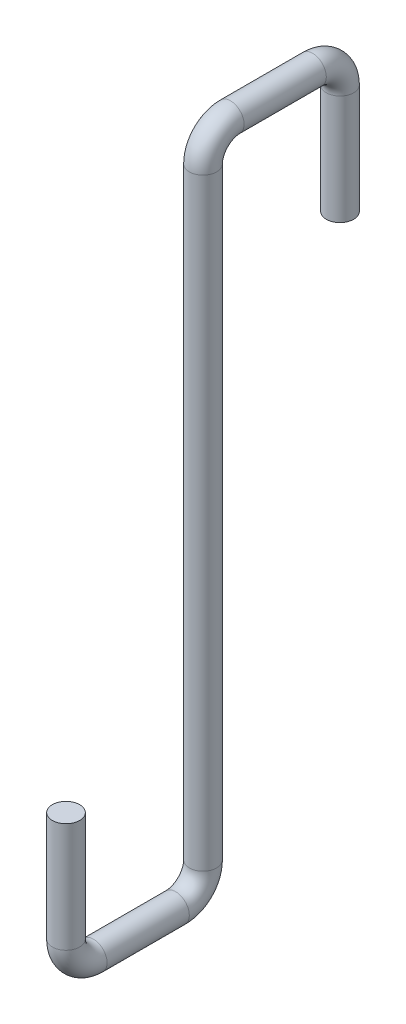
ISO-10303-21;
HEADER;
FILE_DESCRIPTION(('STEP AP214'),'2;1');
FILE_NAME('part.step','',(''),(''),'','','');
FILE_SCHEMA(('AUTOMOTIVE_DESIGN { 1 0 10303 214 1 1 1 1 }'));
ENDSEC;
DATA;
#1=APPLICATION_CONTEXT('core data for automotive mechanical design processes');
#2=APPLICATION_PROTOCOL_DEFINITION('international standard','automotive_design',2000,#1);
#3=PRODUCT_CONTEXT('',#1,'mechanical');
#4=PRODUCT('Part','Part','',(#3));
#5=PRODUCT_RELATED_PRODUCT_CATEGORY('part','',(#4));
#6=PRODUCT_DEFINITION_FORMATION('','',#4);
#7=PRODUCT_DEFINITION_CONTEXT('part definition',#1,'design');
#8=PRODUCT_DEFINITION('design','',#6,#7);
#9=PRODUCT_DEFINITION_SHAPE('','',#8);
#10=(LENGTH_UNIT() NAMED_UNIT(*) SI_UNIT(.MILLI.,.METRE.));
#11=(NAMED_UNIT(*) PLANE_ANGLE_UNIT() SI_UNIT($,.RADIAN.));
#12=(NAMED_UNIT(*) SI_UNIT($,.STERADIAN.) SOLID_ANGLE_UNIT());
#13=UNCERTAINTY_MEASURE_WITH_UNIT(LENGTH_MEASURE(1.E-05),#10,'distance_accuracy_value','');
#14=(GEOMETRIC_REPRESENTATION_CONTEXT(3) GLOBAL_UNCERTAINTY_ASSIGNED_CONTEXT((#13)) GLOBAL_UNIT_ASSIGNED_CONTEXT((#10,
#11,#12)) REPRESENTATION_CONTEXT('',''));
#15=CARTESIAN_POINT('',(0.,0.,0.));
#16=DIRECTION('',(0.,0.,1.));
#17=DIRECTION('',(1.,0.,0.));
#18=AXIS2_PLACEMENT_3D('',#15,#16,#17);
#19=CARTESIAN_POINT('',(0.,-19.,7.50000000000001));
#20=DIRECTION('',(0.,1.,0.));
#21=DIRECTION('',(0.,0.,1.));
#22=AXIS2_PLACEMENT_3D('',#19,#20,#21);
#23=PLANE('',#22);
#24=CARTESIAN_POINT('',(0.,-19.,7.50000000000001));
#25=DIRECTION('',(0.,1.,0.));
#26=DIRECTION('',(0.,0.,1.));
#27=AXIS2_PLACEMENT_3D('',#24,#25,#26);
#28=CIRCLE('',#27,0.5);
#29=CARTESIAN_POINT('',(0.,-19.,8.00000000000001));
#30=VERTEX_POINT('',#29);
#31=EDGE_CURVE('E98',#30,#30,#28,.T.);
#32=ORIENTED_EDGE('',*,*,#31,.T.);
#33=EDGE_LOOP('',(#32));
#34=FACE_BOUND('',#33,.T.);
#35=ADVANCED_FACE('F55',(#34),#23,.T.);
#36=CARTESIAN_POINT('',(0.,-5.,-2.5));
#37=DIRECTION('',(0.,1.,0.));
#38=DIRECTION('',(0.,0.,1.));
#39=AXIS2_PLACEMENT_3D('',#36,#37,#38);
#40=PLANE('',#39);
#41=CARTESIAN_POINT('',(0.,-5.,-2.5));
#42=DIRECTION('',(0.,1.,0.));
#43=DIRECTION('',(0.,0.,1.));
#44=AXIS2_PLACEMENT_3D('',#41,#42,#43);
#45=CIRCLE('',#44,0.5);
#46=CARTESIAN_POINT('',(0.,-5.,-2.));
#47=VERTEX_POINT('',#46);
#48=EDGE_CURVE('E11',#47,#47,#45,.T.);
#49=ORIENTED_EDGE('',*,*,#48,.F.);
#50=EDGE_LOOP('',(#49));
#51=FACE_BOUND('',#50,.T.);
#52=ADVANCED_FACE('F107',(#51),#40,.F.);
#53=CARTESIAN_POINT('',(0.,-19.,7.50000000000001));
#54=DIRECTION('',(0.,-1.,0.));
#55=DIRECTION('',(0.,0.,-1.));
#56=AXIS2_PLACEMENT_3D('',#53,#54,#55);
#57=CYLINDRICAL_SURFACE('',#56,0.5);
#58=CARTESIAN_POINT('',(0.,-23.,7.5));
#59=DIRECTION('',(0.,1.,0.));
#60=DIRECTION('',(0.,0.,1.));
#61=AXIS2_PLACEMENT_3D('',#58,#59,#60);
#62=CIRCLE('',#61,0.5);
#63=CARTESIAN_POINT('',(0.,-23.,8.00000000000002));
#64=VERTEX_POINT('',#63);
#65=EDGE_CURVE('E94',#64,#64,#62,.T.);
#66=ORIENTED_EDGE('',*,*,#65,.T.);
#67=EDGE_LOOP('',(#66));
#68=FACE_BOUND('',#67,.T.);
#69=ORIENTED_EDGE('',*,*,#31,.F.);
#70=EDGE_LOOP('',(#69));
#71=FACE_BOUND('',#70,.T.);
#72=ADVANCED_FACE('F104',(#68,#71),#57,.T.);
#73=CARTESIAN_POINT('',(0.,-23.,6.5));
#74=DIRECTION('',(1.,0.,0.));
#75=DIRECTION('',(0.,0.,-1.));
#76=AXIS2_PLACEMENT_3D('',#73,#74,#75);
#77=TOROIDAL_SURFACE('',#76,1.00000000000002,0.5);
#78=CARTESIAN_POINT('',(0.,-24.,6.5));
#79=DIRECTION('',(0.,0.,1.));
#80=DIRECTION('',(0.,-1.,0.));
#81=AXIS2_PLACEMENT_3D('',#78,#79,#80);
#82=CIRCLE('',#81,0.5);
#83=CARTESIAN_POINT('',(0.,-24.5,6.5));
#84=VERTEX_POINT('',#83);
#85=EDGE_CURVE('E90',#84,#84,#82,.T.);
#86=CARTESIAN_POINT('',(0.,-23.,6.5));
#87=DIRECTION('',(1.,0.,0.));
#88=DIRECTION('',(0.,0.,-1.));
#89=AXIS2_PLACEMENT_3D('',#86,#87,#88);
#90=CIRCLE('',#89,1.50000000000002);
#91=EDGE_CURVE('',#64,#84,#90,.T.);
#92=ORIENTED_EDGE('',*,*,#65,.F.);
#93=ORIENTED_EDGE('',*,*,#85,.T.);
#94=ORIENTED_EDGE('',*,*,#91,.T.);
#95=ORIENTED_EDGE('',*,*,#91,.F.);
#96=EDGE_LOOP('',(#92,#94,#93,#95));
#97=FACE_BOUND('',#96,.T.);
#98=ADVANCED_FACE('F106',(#97),#77,.T.);
#99=CARTESIAN_POINT('',(0.,-24.,6.5));
#100=DIRECTION('',(0.,0.,-1.));
#101=DIRECTION('',(-1.,0.,0.));
#102=AXIS2_PLACEMENT_3D('',#99,#100,#101);
#103=CYLINDRICAL_SURFACE('',#102,0.5);
#104=CARTESIAN_POINT('',(0.,-24.,3.5));
#105=DIRECTION('',(0.,0.,1.));
#106=DIRECTION('',(0.,-1.,0.));
#107=AXIS2_PLACEMENT_3D('',#104,#105,#106);
#108=CIRCLE('',#107,0.5);
#109=CARTESIAN_POINT('',(0.,-24.5,3.5));
#110=VERTEX_POINT('',#109);
#111=EDGE_CURVE('E86',#110,#110,#108,.T.);
#112=ORIENTED_EDGE('',*,*,#111,.T.);
#113=EDGE_LOOP('',(#112));
#114=FACE_BOUND('',#113,.T.);
#115=ORIENTED_EDGE('',*,*,#85,.F.);
#116=EDGE_LOOP('',(#115));
#117=FACE_BOUND('',#116,.T.);
#118=ADVANCED_FACE('F114',(#114,#117),#103,.T.);
#119=CARTESIAN_POINT('',(0.,-23.,3.5));
#120=DIRECTION('',(1.,0.,0.));
#121=DIRECTION('',(0.,0.,-1.));
#122=AXIS2_PLACEMENT_3D('',#119,#120,#121);
#123=TOROIDAL_SURFACE('',#122,1.,0.5);
#124=CARTESIAN_POINT('',(0.,-23.,2.5));
#125=DIRECTION('',(0.,-1.,0.));
#126=DIRECTION('',(0.,0.,-1.));
#127=AXIS2_PLACEMENT_3D('',#124,#125,#126);
#128=CIRCLE('',#127,0.5);
#129=CARTESIAN_POINT('',(0.,-23.,2.));
#130=VERTEX_POINT('',#129);
#131=EDGE_CURVE('E82',#130,#130,#128,.T.);
#132=CARTESIAN_POINT('',(0.,-23.,3.5));
#133=DIRECTION('',(1.,0.,0.));
#134=DIRECTION('',(0.,0.,-1.));
#135=AXIS2_PLACEMENT_3D('',#132,#133,#134);
#136=CIRCLE('',#135,1.5);
#137=EDGE_CURVE('',#110,#130,#136,.T.);
#138=ORIENTED_EDGE('',*,*,#111,.F.);
#139=ORIENTED_EDGE('',*,*,#131,.T.);
#140=ORIENTED_EDGE('',*,*,#137,.T.);
#141=ORIENTED_EDGE('',*,*,#137,.F.);
#142=EDGE_LOOP('',(#138,#140,#139,#141));
#143=FACE_BOUND('',#142,.T.);
#144=ADVANCED_FACE('F139',(#143),#123,.T.);
#145=CARTESIAN_POINT('',(0.,-23.,2.5));
#146=DIRECTION('',(0.,1.,0.));
#147=DIRECTION('',(-1.,0.,0.));
#148=AXIS2_PLACEMENT_3D('',#145,#146,#147);
#149=CYLINDRICAL_SURFACE('',#148,0.5);
#150=CARTESIAN_POINT('',(0.,-1.,2.5));
#151=DIRECTION('',(0.,-1.,0.));
#152=DIRECTION('',(0.,0.,-1.));
#153=AXIS2_PLACEMENT_3D('',#150,#151,#152);
#154=CIRCLE('',#153,0.5);
#155=CARTESIAN_POINT('',(0.,-1.,3.));
#156=VERTEX_POINT('',#155);
#157=EDGE_CURVE('E78',#156,#156,#154,.T.);
#158=ORIENTED_EDGE('',*,*,#157,.T.);
#159=EDGE_LOOP('',(#158));
#160=FACE_BOUND('',#159,.T.);
#161=ORIENTED_EDGE('',*,*,#131,.F.);
#162=EDGE_LOOP('',(#161));
#163=FACE_BOUND('',#162,.T.);
#164=ADVANCED_FACE('F135',(#160,#163),#149,.T.);
#165=CARTESIAN_POINT('',(0.,-1.,1.5));
#166=DIRECTION('',(-1.,0.,0.));
#167=DIRECTION('',(0.,0.,1.));
#168=AXIS2_PLACEMENT_3D('',#165,#166,#167);
#169=TOROIDAL_SURFACE('',#168,1.,0.5);
#170=CARTESIAN_POINT('',(0.,0.,1.5));
#171=DIRECTION('',(0.,0.,1.));
#172=DIRECTION('',(0.,-1.,0.));
#173=AXIS2_PLACEMENT_3D('',#170,#171,#172);
#174=CIRCLE('',#173,0.5);
#175=CARTESIAN_POINT('',(0.,0.5,1.5));
#176=VERTEX_POINT('',#175);
#177=EDGE_CURVE('E72',#176,#176,#174,.T.);
#178=CARTESIAN_POINT('',(0.,-1.,1.5));
#179=DIRECTION('',(-1.,0.,0.));
#180=DIRECTION('',(0.,0.,1.));
#181=AXIS2_PLACEMENT_3D('',#178,#179,#180);
#182=CIRCLE('',#181,1.5);
#183=EDGE_CURVE('',#156,#176,#182,.T.);
#184=ORIENTED_EDGE('',*,*,#157,.F.);
#185=ORIENTED_EDGE('',*,*,#177,.T.);
#186=ORIENTED_EDGE('',*,*,#183,.T.);
#187=ORIENTED_EDGE('',*,*,#183,.F.);
#188=EDGE_LOOP('',(#184,#186,#185,#187));
#189=FACE_BOUND('',#188,.T.);
#190=ADVANCED_FACE('F131',(#189),#169,.T.);
#191=CARTESIAN_POINT('',(0.,0.,1.5));
#192=DIRECTION('',(0.,0.,-1.));
#193=DIRECTION('',(-1.,0.,0.));
#194=AXIS2_PLACEMENT_3D('',#191,#192,#193);
#195=CYLINDRICAL_SURFACE('',#194,0.5);
#196=CARTESIAN_POINT('',(0.,0.,-1.5));
#197=DIRECTION('',(0.,0.,1.));
#198=DIRECTION('',(0.,-1.,0.));
#199=AXIS2_PLACEMENT_3D('',#196,#197,#198);
#200=CIRCLE('',#199,0.5);
#201=CARTESIAN_POINT('',(0.,0.5,-1.5));
#202=VERTEX_POINT('',#201);
#203=EDGE_CURVE('E67',#202,#202,#200,.T.);
#204=ORIENTED_EDGE('',*,*,#203,.T.);
#205=EDGE_LOOP('',(#204));
#206=FACE_BOUND('',#205,.T.);
#207=ORIENTED_EDGE('',*,*,#177,.F.);
#208=EDGE_LOOP('',(#207));
#209=FACE_BOUND('',#208,.T.);
#210=ADVANCED_FACE('F125',(#206,#209),#195,.T.);
#211=CARTESIAN_POINT('',(0.,-1.,-1.5));
#212=DIRECTION('',(-1.,0.,0.));
#213=DIRECTION('',(0.,0.,1.));
#214=AXIS2_PLACEMENT_3D('',#211,#212,#213);
#215=TOROIDAL_SURFACE('',#214,1.,0.5);
#216=CARTESIAN_POINT('',(0.,-1.,-2.5));
#217=DIRECTION('',(0.,1.,0.));
#218=DIRECTION('',(0.,0.,1.));
#219=AXIS2_PLACEMENT_3D('',#216,#217,#218);
#220=CIRCLE('',#219,0.5);
#221=CARTESIAN_POINT('',(0.,-1.,-3.));
#222=VERTEX_POINT('',#221);
#223=EDGE_CURVE('E62',#222,#222,#220,.T.);
#224=CARTESIAN_POINT('',(0.,-1.,-1.5));
#225=DIRECTION('',(-1.,0.,0.));
#226=DIRECTION('',(0.,0.,1.));
#227=AXIS2_PLACEMENT_3D('',#224,#225,#226);
#228=CIRCLE('',#227,1.5);
#229=EDGE_CURVE('',#202,#222,#228,.T.);
#230=ORIENTED_EDGE('',*,*,#203,.F.);
#231=ORIENTED_EDGE('',*,*,#223,.T.);
#232=ORIENTED_EDGE('',*,*,#229,.T.);
#233=ORIENTED_EDGE('',*,*,#229,.F.);
#234=EDGE_LOOP('',(#230,#232,#231,#233));
#235=FACE_BOUND('',#234,.T.);
#236=ADVANCED_FACE('F120',(#235),#215,.T.);
#237=CARTESIAN_POINT('',(0.,-1.,-2.5));
#238=DIRECTION('',(0.,-1.,0.));
#239=DIRECTION('',(0.,0.,-1.));
#240=AXIS2_PLACEMENT_3D('',#237,#238,#239);
#241=CYLINDRICAL_SURFACE('',#240,0.5);
#242=ORIENTED_EDGE('',*,*,#48,.T.);
#243=EDGE_LOOP('',(#242));
#244=FACE_BOUND('',#243,.T.);
#245=ORIENTED_EDGE('',*,*,#223,.F.);
#246=EDGE_LOOP('',(#245));
#247=FACE_BOUND('',#246,.T.);
#248=ADVANCED_FACE('F118',(#244,#247),#241,.T.);
#249=CLOSED_SHELL('',(#35,#52,#72,#98,#118,#144,#164,#190,#210,#236,#248));
#250=MANIFOLD_SOLID_BREP('B2',#249);
#251=ADVANCED_BREP_SHAPE_REPRESENTATION('',(#18,#250),#14);
#252=SHAPE_DEFINITION_REPRESENTATION(#9,#251);
ENDSEC;
END-ISO-10303-21;
